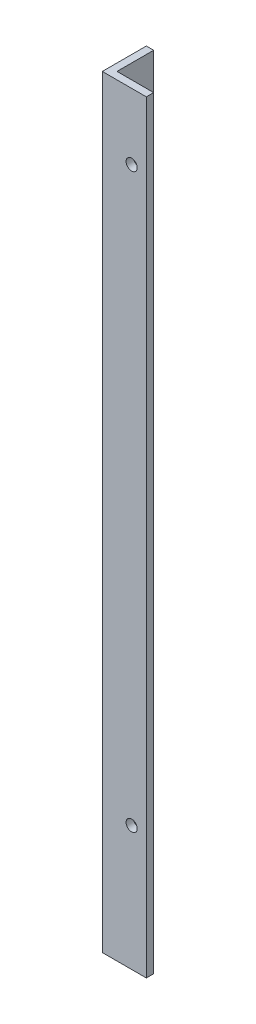
ISO-10303-21;
HEADER;
FILE_DESCRIPTION(('STEP AP214'),'2;1');
FILE_NAME('part.step','',(''),(''),'','','');
FILE_SCHEMA(('AUTOMOTIVE_DESIGN { 1 0 10303 214 1 1 1 1 }'));
ENDSEC;
DATA;
#1=APPLICATION_CONTEXT('core data for automotive mechanical design processes');
#2=APPLICATION_PROTOCOL_DEFINITION('international standard','automotive_design',2000,#1);
#3=PRODUCT_CONTEXT('',#1,'mechanical');
#4=PRODUCT('Part','Part','',(#3));
#5=PRODUCT_RELATED_PRODUCT_CATEGORY('part','',(#4));
#6=PRODUCT_DEFINITION_FORMATION('','',#4);
#7=PRODUCT_DEFINITION_CONTEXT('part definition',#1,'design');
#8=PRODUCT_DEFINITION('design','',#6,#7);
#9=PRODUCT_DEFINITION_SHAPE('','',#8);
#10=(LENGTH_UNIT() NAMED_UNIT(*) SI_UNIT(.MILLI.,.METRE.));
#11=(NAMED_UNIT(*) PLANE_ANGLE_UNIT() SI_UNIT($,.RADIAN.));
#12=(NAMED_UNIT(*) SI_UNIT($,.STERADIAN.) SOLID_ANGLE_UNIT());
#13=UNCERTAINTY_MEASURE_WITH_UNIT(LENGTH_MEASURE(1.E-05),#10,'distance_accuracy_value','');
#14=(GEOMETRIC_REPRESENTATION_CONTEXT(3) GLOBAL_UNCERTAINTY_ASSIGNED_CONTEXT((#13)) GLOBAL_UNIT_ASSIGNED_CONTEXT((#10,
#11,#12)) REPRESENTATION_CONTEXT('',''));
#15=CARTESIAN_POINT('',(0.,0.,0.));
#16=DIRECTION('',(0.,0.,1.));
#17=DIRECTION('',(1.,0.,0.));
#18=AXIS2_PLACEMENT_3D('',#15,#16,#17);
#19=CARTESIAN_POINT('',(0.,330.2,0.));
#20=DIRECTION('',(1.,0.,0.));
#21=DIRECTION('',(0.,0.,-1.));
#22=AXIS2_PLACEMENT_3D('',#19,#20,#21);
#23=PLANE('',#22);
#24=DIRECTION('',(0.,0.,1.));
#25=VECTOR('',#24,1.);
#26=CARTESIAN_POINT('',(0.,0.,0.));
#27=LINE('',#26,#25);
#28=CARTESIAN_POINT('',(0.,0.,-19.05));
#29=VERTEX_POINT('',#28);
#30=CARTESIAN_POINT('',(0.,0.,0.));
#31=VERTEX_POINT('',#30);
#32=EDGE_CURVE('E123',#29,#31,#27,.T.);
#33=ORIENTED_EDGE('',*,*,#32,.T.);
#34=DIRECTION('',(0.,-1.,0.));
#35=VECTOR('',#34,1.);
#36=CARTESIAN_POINT('',(0.,330.2,0.));
#37=LINE('',#36,#35);
#38=CARTESIAN_POINT('',(0.,330.2,0.));
#39=VERTEX_POINT('',#38);
#40=EDGE_CURVE('E11',#39,#31,#37,.T.);
#41=ORIENTED_EDGE('',*,*,#40,.F.);
#42=DIRECTION('',(0.,0.,1.));
#43=VECTOR('',#42,1.);
#44=CARTESIAN_POINT('',(0.,330.2,0.));
#45=LINE('',#44,#43);
#46=CARTESIAN_POINT('',(0.,330.2,-19.05));
#47=VERTEX_POINT('',#46);
#48=EDGE_CURVE('E134',#47,#39,#45,.T.);
#49=ORIENTED_EDGE('',*,*,#48,.F.);
#50=DIRECTION('',(0.,-1.,0.));
#51=VECTOR('',#50,1.);
#52=CARTESIAN_POINT('',(0.,330.2,-19.05));
#53=LINE('',#52,#51);
#54=EDGE_CURVE('E119',#47,#29,#53,.T.);
#55=ORIENTED_EDGE('',*,*,#54,.T.);
#56=EDGE_LOOP('',(#33,#41,#49,#55));
#57=FACE_BOUND('',#56,.T.);
#58=ADVANCED_FACE('F39',(#57),#23,.F.);
#59=CARTESIAN_POINT('',(0.,330.2,0.));
#60=DIRECTION('',(0.,0.,-1.));
#61=DIRECTION('',(-1.,0.,0.));
#62=AXIS2_PLACEMENT_3D('',#59,#60,#61);
#63=PLANE('',#62);
#64=CARTESIAN_POINT('',(12.6999999999999,53.9749999999999,0.));
#65=DIRECTION('',(0.,0.,-1.));
#66=DIRECTION('',(-1.,0.,0.));
#67=AXIS2_PLACEMENT_3D('',#64,#65,#66);
#68=CIRCLE('',#67,2.413);
#69=CARTESIAN_POINT('',(10.2869999999999,53.9749999999999,0.));
#70=VERTEX_POINT('',#69);
#71=EDGE_CURVE('E127',#70,#70,#68,.F.);
#72=ORIENTED_EDGE('',*,*,#71,.F.);
#73=EDGE_LOOP('',(#72));
#74=FACE_BOUND('',#73,.T.);
#75=CARTESIAN_POINT('',(12.6999999999999,301.625,0.));
#76=DIRECTION('',(0.,0.,-1.));
#77=DIRECTION('',(-1.,0.,0.));
#78=AXIS2_PLACEMENT_3D('',#75,#76,#77);
#79=CIRCLE('',#78,2.413);
#80=CARTESIAN_POINT('',(10.2869999999999,301.625,0.));
#81=VERTEX_POINT('',#80);
#82=EDGE_CURVE('E182',#81,#81,#79,.F.);
#83=ORIENTED_EDGE('',*,*,#82,.F.);
#84=EDGE_LOOP('',(#83));
#85=FACE_BOUND('',#84,.T.);
#86=DIRECTION('',(1.,0.,0.));
#87=VECTOR('',#86,1.);
#88=CARTESIAN_POINT('',(0.,0.,0.));
#89=LINE('',#88,#87);
#90=CARTESIAN_POINT('',(19.05,0.,0.));
#91=VERTEX_POINT('',#90);
#92=EDGE_CURVE('E126',#31,#91,#89,.T.);
#93=ORIENTED_EDGE('',*,*,#92,.T.);
#94=DIRECTION('',(0.,-1.,0.));
#95=VECTOR('',#94,1.);
#96=CARTESIAN_POINT('',(19.05,330.2,0.));
#97=LINE('',#96,#95);
#98=CARTESIAN_POINT('',(19.05,330.2,0.));
#99=VERTEX_POINT('',#98);
#100=EDGE_CURVE('E47',#99,#91,#97,.T.);
#101=ORIENTED_EDGE('',*,*,#100,.F.);
#102=DIRECTION('',(1.,0.,0.));
#103=VECTOR('',#102,1.);
#104=CARTESIAN_POINT('',(0.,330.2,0.));
#105=LINE('',#104,#103);
#106=EDGE_CURVE('E92',#39,#99,#105,.T.);
#107=ORIENTED_EDGE('',*,*,#106,.F.);
#108=ORIENTED_EDGE('',*,*,#40,.T.);
#109=EDGE_LOOP('',(#93,#101,#107,#108));
#110=FACE_BOUND('',#109,.T.);
#111=ADVANCED_FACE('F158',(#74,#85,#110),#63,.F.);
#112=CARTESIAN_POINT('',(19.05,330.2,0.));
#113=DIRECTION('',(-1.,0.,0.));
#114=DIRECTION('',(0.,0.,1.));
#115=AXIS2_PLACEMENT_3D('',#112,#113,#114);
#116=PLANE('',#115);
#117=DIRECTION('',(0.,0.,-1.));
#118=VECTOR('',#117,1.);
#119=CARTESIAN_POINT('',(19.05,0.,0.));
#120=LINE('',#119,#118);
#121=CARTESIAN_POINT('',(19.05,0.,-3.175));
#122=VERTEX_POINT('',#121);
#123=EDGE_CURVE('E129',#91,#122,#120,.T.);
#124=ORIENTED_EDGE('',*,*,#123,.T.);
#125=DIRECTION('',(0.,-1.,0.));
#126=VECTOR('',#125,1.);
#127=CARTESIAN_POINT('',(19.05,330.2,-3.175));
#128=LINE('',#127,#126);
#129=CARTESIAN_POINT('',(19.05,330.2,-3.175));
#130=VERTEX_POINT('',#129);
#131=EDGE_CURVE('E114',#130,#122,#128,.T.);
#132=ORIENTED_EDGE('',*,*,#131,.F.);
#133=DIRECTION('',(0.,0.,-1.));
#134=VECTOR('',#133,1.);
#135=CARTESIAN_POINT('',(19.05,330.2,0.));
#136=LINE('',#135,#134);
#137=EDGE_CURVE('E105',#99,#130,#136,.T.);
#138=ORIENTED_EDGE('',*,*,#137,.F.);
#139=ORIENTED_EDGE('',*,*,#100,.T.);
#140=EDGE_LOOP('',(#124,#132,#138,#139));
#141=FACE_BOUND('',#140,.T.);
#142=ADVANCED_FACE('F140',(#141),#116,.F.);
#143=CARTESIAN_POINT('',(3.175,330.2,-3.175));
#144=DIRECTION('',(0.,0.,1.));
#145=DIRECTION('',(1.,0.,0.));
#146=AXIS2_PLACEMENT_3D('',#143,#144,#145);
#147=PLANE('',#146);
#148=CARTESIAN_POINT('',(12.6999999999999,53.9749999999999,-3.175));
#149=DIRECTION('',(0.,0.,-1.));
#150=DIRECTION('',(-1.,0.,0.));
#151=AXIS2_PLACEMENT_3D('',#148,#149,#150);
#152=CIRCLE('',#151,2.413);
#153=CARTESIAN_POINT('',(10.2869999999999,53.9749999999999,-3.175));
#154=VERTEX_POINT('',#153);
#155=EDGE_CURVE('E177',#154,#154,#152,.T.);
#156=ORIENTED_EDGE('',*,*,#155,.F.);
#157=EDGE_LOOP('',(#156));
#158=FACE_BOUND('',#157,.T.);
#159=CARTESIAN_POINT('',(12.6999999999999,301.625,-3.175));
#160=DIRECTION('',(0.,0.,-1.));
#161=DIRECTION('',(-1.,0.,0.));
#162=AXIS2_PLACEMENT_3D('',#159,#160,#161);
#163=CIRCLE('',#162,2.413);
#164=CARTESIAN_POINT('',(10.2869999999999,301.625,-3.175));
#165=VERTEX_POINT('',#164);
#166=EDGE_CURVE('E180',#165,#165,#163,.T.);
#167=ORIENTED_EDGE('',*,*,#166,.F.);
#168=EDGE_LOOP('',(#167));
#169=FACE_BOUND('',#168,.T.);
#170=DIRECTION('',(-1.,0.,0.));
#171=VECTOR('',#170,1.);
#172=CARTESIAN_POINT('',(3.175,0.,-3.175));
#173=LINE('',#172,#171);
#174=CARTESIAN_POINT('',(3.175,0.,-3.175));
#175=VERTEX_POINT('',#174);
#176=EDGE_CURVE('E113',#122,#175,#173,.T.);
#177=ORIENTED_EDGE('',*,*,#176,.T.);
#178=DIRECTION('',(0.,-1.,0.));
#179=VECTOR('',#178,1.);
#180=CARTESIAN_POINT('',(3.175,330.2,-3.175));
#181=LINE('',#180,#179);
#182=CARTESIAN_POINT('',(3.175,330.2,-3.175));
#183=VERTEX_POINT('',#182);
#184=EDGE_CURVE('E110',#183,#175,#181,.T.);
#185=ORIENTED_EDGE('',*,*,#184,.F.);
#186=DIRECTION('',(-1.,0.,0.));
#187=VECTOR('',#186,1.);
#188=CARTESIAN_POINT('',(3.175,330.2,-3.175));
#189=LINE('',#188,#187);
#190=EDGE_CURVE('E99',#130,#183,#189,.T.);
#191=ORIENTED_EDGE('',*,*,#190,.F.);
#192=ORIENTED_EDGE('',*,*,#131,.T.);
#193=EDGE_LOOP('',(#177,#185,#191,#192));
#194=FACE_BOUND('',#193,.T.);
#195=ADVANCED_FACE('F111',(#158,#169,#194),#147,.F.);
#196=CARTESIAN_POINT('',(3.175,330.2,-3.175));
#197=DIRECTION('',(-1.,0.,0.));
#198=DIRECTION('',(0.,0.,1.));
#199=AXIS2_PLACEMENT_3D('',#196,#197,#198);
#200=PLANE('',#199);
#201=DIRECTION('',(0.,0.,-1.));
#202=VECTOR('',#201,1.);
#203=CARTESIAN_POINT('',(3.175,0.,-3.175));
#204=LINE('',#203,#202);
#205=CARTESIAN_POINT('',(3.175,0.,-19.05));
#206=VERTEX_POINT('',#205);
#207=EDGE_CURVE('E78',#175,#206,#204,.T.);
#208=ORIENTED_EDGE('',*,*,#207,.T.);
#209=DIRECTION('',(0.,-1.,0.));
#210=VECTOR('',#209,1.);
#211=CARTESIAN_POINT('',(3.175,330.2,-19.05));
#212=LINE('',#211,#210);
#213=CARTESIAN_POINT('',(3.175,330.2,-19.05));
#214=VERTEX_POINT('',#213);
#215=EDGE_CURVE('E115',#214,#206,#212,.T.);
#216=ORIENTED_EDGE('',*,*,#215,.F.);
#217=DIRECTION('',(0.,0.,-1.));
#218=VECTOR('',#217,1.);
#219=CARTESIAN_POINT('',(3.175,330.2,-3.175));
#220=LINE('',#219,#218);
#221=EDGE_CURVE('E103',#183,#214,#220,.T.);
#222=ORIENTED_EDGE('',*,*,#221,.F.);
#223=ORIENTED_EDGE('',*,*,#184,.T.);
#224=EDGE_LOOP('',(#208,#216,#222,#223));
#225=FACE_BOUND('',#224,.T.);
#226=ADVANCED_FACE('F117',(#225),#200,.F.);
#227=CARTESIAN_POINT('',(0.,330.2,-19.05));
#228=DIRECTION('',(0.,0.,1.));
#229=DIRECTION('',(1.,0.,0.));
#230=AXIS2_PLACEMENT_3D('',#227,#228,#229);
#231=PLANE('',#230);
#232=DIRECTION('',(-1.,0.,0.));
#233=VECTOR('',#232,1.);
#234=CARTESIAN_POINT('',(0.,0.,-19.05));
#235=LINE('',#234,#233);
#236=EDGE_CURVE('E84',#206,#29,#235,.T.);
#237=ORIENTED_EDGE('',*,*,#236,.T.);
#238=ORIENTED_EDGE('',*,*,#54,.F.);
#239=DIRECTION('',(-1.,0.,0.));
#240=VECTOR('',#239,1.);
#241=CARTESIAN_POINT('',(0.,330.2,-19.05));
#242=LINE('',#241,#240);
#243=EDGE_CURVE('E55',#214,#47,#242,.T.);
#244=ORIENTED_EDGE('',*,*,#243,.F.);
#245=ORIENTED_EDGE('',*,*,#215,.T.);
#246=EDGE_LOOP('',(#237,#238,#244,#245));
#247=FACE_BOUND('',#246,.T.);
#248=ADVANCED_FACE('F147',(#247),#231,.F.);
#249=CARTESIAN_POINT('',(0.,330.2,0.));
#250=DIRECTION('',(0.,-1.,0.));
#251=DIRECTION('',(0.,0.,-1.));
#252=AXIS2_PLACEMENT_3D('',#249,#250,#251);
#253=PLANE('',#252);
#254=ORIENTED_EDGE('',*,*,#48,.T.);
#255=ORIENTED_EDGE('',*,*,#106,.T.);
#256=ORIENTED_EDGE('',*,*,#137,.T.);
#257=ORIENTED_EDGE('',*,*,#190,.T.);
#258=ORIENTED_EDGE('',*,*,#221,.T.);
#259=ORIENTED_EDGE('',*,*,#243,.T.);
#260=EDGE_LOOP('',(#254,#255,#256,#257,#258,#259));
#261=FACE_BOUND('',#260,.T.);
#262=ADVANCED_FACE('F101',(#261),#253,.F.);
#263=CARTESIAN_POINT('',(0.,0.,0.));
#264=DIRECTION('',(0.,-1.,0.));
#265=DIRECTION('',(0.,0.,-1.));
#266=AXIS2_PLACEMENT_3D('',#263,#264,#265);
#267=PLANE('',#266);
#268=ORIENTED_EDGE('',*,*,#32,.F.);
#269=ORIENTED_EDGE('',*,*,#236,.F.);
#270=ORIENTED_EDGE('',*,*,#207,.F.);
#271=ORIENTED_EDGE('',*,*,#176,.F.);
#272=ORIENTED_EDGE('',*,*,#123,.F.);
#273=ORIENTED_EDGE('',*,*,#92,.F.);
#274=EDGE_LOOP('',(#268,#269,#270,#271,#272,#273));
#275=FACE_BOUND('',#274,.T.);
#276=ADVANCED_FACE('F143',(#275),#267,.T.);
#277=CARTESIAN_POINT('',(12.6999999999999,301.625,0.00100000000000013));
#278=DIRECTION('',(0.,0.,-1.));
#279=DIRECTION('',(-1.,0.,0.));
#280=AXIS2_PLACEMENT_3D('',#277,#278,#279);
#281=CYLINDRICAL_SURFACE('',#280,2.413);
#282=ORIENTED_EDGE('',*,*,#166,.T.);
#283=EDGE_LOOP('',(#282));
#284=FACE_BOUND('',#283,.T.);
#285=ORIENTED_EDGE('',*,*,#82,.T.);
#286=EDGE_LOOP('',(#285));
#287=FACE_BOUND('',#286,.T.);
#288=ADVANCED_FACE('F195',(#284,#287),#281,.F.);
#289=CARTESIAN_POINT('',(12.6999999999999,53.9749999999999,0.00100000000000013));
#290=DIRECTION('',(0.,0.,-1.));
#291=DIRECTION('',(-1.,0.,0.));
#292=AXIS2_PLACEMENT_3D('',#289,#290,#291);
#293=CYLINDRICAL_SURFACE('',#292,2.413);
#294=ORIENTED_EDGE('',*,*,#155,.T.);
#295=EDGE_LOOP('',(#294));
#296=FACE_BOUND('',#295,.T.);
#297=ORIENTED_EDGE('',*,*,#71,.T.);
#298=EDGE_LOOP('',(#297));
#299=FACE_BOUND('',#298,.T.);
#300=ADVANCED_FACE('F192',(#296,#299),#293,.F.);
#301=CLOSED_SHELL('',(#58,#111,#142,#195,#226,#248,#262,#276,#288,#300));
#302=MANIFOLD_SOLID_BREP('B2',#301);
#303=ADVANCED_BREP_SHAPE_REPRESENTATION('',(#18,#302),#14);
#304=SHAPE_DEFINITION_REPRESENTATION(#9,#303);
ENDSEC;
END-ISO-10303-21;
